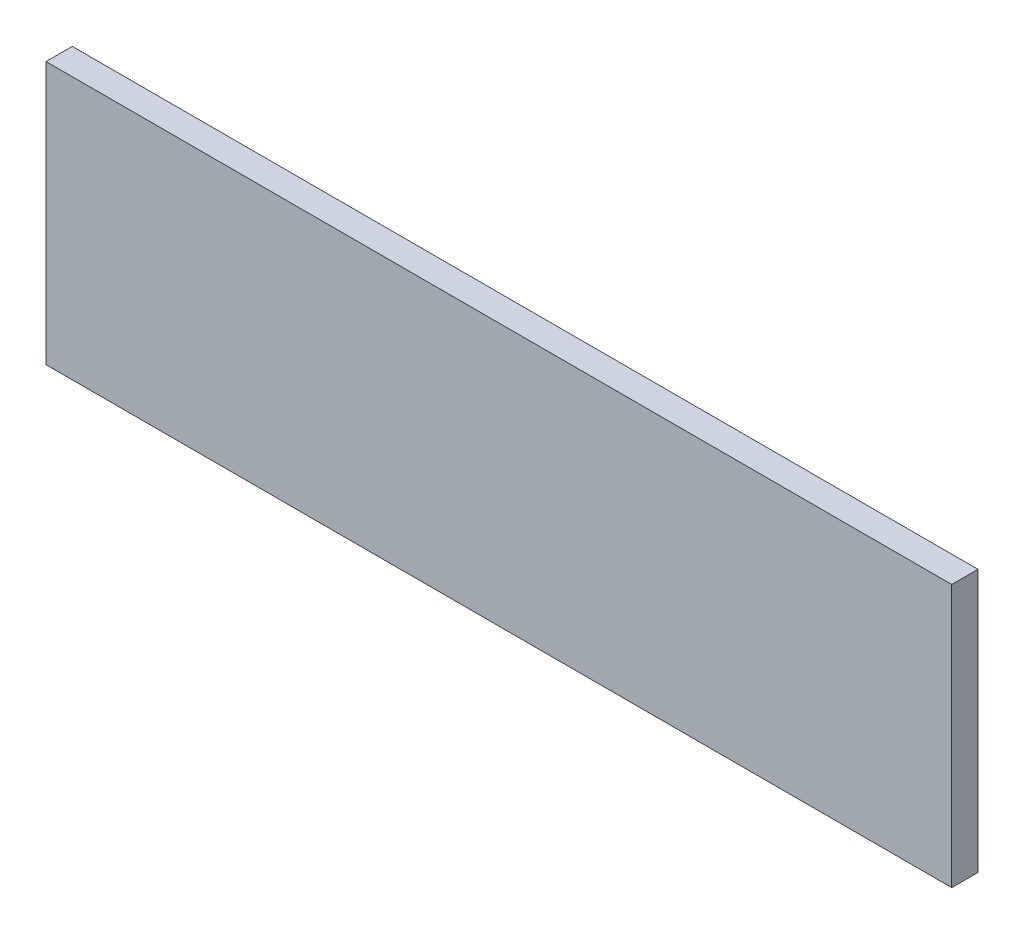
ISO-10303-21;
HEADER;
FILE_DESCRIPTION(('STEP AP214'),'2;1');
FILE_NAME('part.step','',(''),(''),'','','');
FILE_SCHEMA(('AUTOMOTIVE_DESIGN { 1 0 10303 214 1 1 1 1 }'));
ENDSEC;
DATA;
#1=APPLICATION_CONTEXT('core data for automotive mechanical design processes');
#2=APPLICATION_PROTOCOL_DEFINITION('international standard','automotive_design',2000,#1);
#3=PRODUCT_CONTEXT('',#1,'mechanical');
#4=PRODUCT('Part','Part','',(#3));
#5=PRODUCT_RELATED_PRODUCT_CATEGORY('part','',(#4));
#6=PRODUCT_DEFINITION_FORMATION('','',#4);
#7=PRODUCT_DEFINITION_CONTEXT('part definition',#1,'design');
#8=PRODUCT_DEFINITION('design','',#6,#7);
#9=PRODUCT_DEFINITION_SHAPE('','',#8);
#10=(LENGTH_UNIT() NAMED_UNIT(*) SI_UNIT(.MILLI.,.METRE.));
#11=(NAMED_UNIT(*) PLANE_ANGLE_UNIT() SI_UNIT($,.RADIAN.));
#12=(NAMED_UNIT(*) SI_UNIT($,.STERADIAN.) SOLID_ANGLE_UNIT());
#13=UNCERTAINTY_MEASURE_WITH_UNIT(LENGTH_MEASURE(1.E-05),#10,'distance_accuracy_value','');
#14=(GEOMETRIC_REPRESENTATION_CONTEXT(3) GLOBAL_UNCERTAINTY_ASSIGNED_CONTEXT((#13)) GLOBAL_UNIT_ASSIGNED_CONTEXT((#10,
#11,#12)) REPRESENTATION_CONTEXT('',''));
#15=CARTESIAN_POINT('',(0.,0.,0.));
#16=DIRECTION('',(0.,0.,1.));
#17=DIRECTION('',(1.,0.,0.));
#18=AXIS2_PLACEMENT_3D('',#15,#16,#17);
#19=CARTESIAN_POINT('',(2.96,-0.51,0.));
#20=DIRECTION('',(0.,0.,-1.));
#21=DIRECTION('',(-1.,0.,0.));
#22=AXIS2_PLACEMENT_3D('',#19,#20,#21);
#23=PLANE('',#22);
#24=DIRECTION('',(0.,-1.,0.));
#25=VECTOR('',#24,1.);
#26=CARTESIAN_POINT('',(-0.5,0.,0.));
#27=LINE('',#26,#25);
#28=CARTESIAN_POINT('',(-0.5,0.5,0.));
#29=VERTEX_POINT('',#28);
#30=CARTESIAN_POINT('',(-0.5,-0.5,0.));
#31=VERTEX_POINT('',#30);
#32=EDGE_CURVE('E68',#29,#31,#27,.T.);
#33=ORIENTED_EDGE('',*,*,#32,.F.);
#34=DIRECTION('',(-1.,0.,0.));
#35=VECTOR('',#34,1.);
#36=CARTESIAN_POINT('',(1.225,0.5,0.));
#37=LINE('',#36,#35);
#38=CARTESIAN_POINT('',(2.95,0.5,0.));
#39=VERTEX_POINT('',#38);
#40=EDGE_CURVE('E55',#39,#29,#37,.T.);
#41=ORIENTED_EDGE('',*,*,#40,.F.);
#42=DIRECTION('',(0.,1.,0.));
#43=VECTOR('',#42,1.);
#44=CARTESIAN_POINT('',(2.95,0.,0.));
#45=LINE('',#44,#43);
#46=CARTESIAN_POINT('',(2.95,-0.5,0.));
#47=VERTEX_POINT('',#46);
#48=EDGE_CURVE('E20',#47,#39,#45,.T.);
#49=ORIENTED_EDGE('',*,*,#48,.F.);
#50=DIRECTION('',(1.,0.,0.));
#51=VECTOR('',#50,1.);
#52=CARTESIAN_POINT('',(1.225,-0.5,0.));
#53=LINE('',#52,#51);
#54=EDGE_CURVE('E80',#31,#47,#53,.T.);
#55=ORIENTED_EDGE('',*,*,#54,.F.);
#56=EDGE_LOOP('',(#33,#41,#49,#55));
#57=FACE_BOUND('',#56,.T.);
#58=ADVANCED_FACE('F16',(#57),#23,.T.);
#59=CARTESIAN_POINT('',(2.95,-0.51,0.11));
#60=DIRECTION('',(1.,0.,0.));
#61=DIRECTION('',(0.,0.,-1.));
#62=AXIS2_PLACEMENT_3D('',#59,#60,#61);
#63=PLANE('',#62);
#64=DIRECTION('',(0.,0.,-1.));
#65=VECTOR('',#64,1.);
#66=CARTESIAN_POINT('',(2.95,0.5,0.05));
#67=LINE('',#66,#65);
#68=CARTESIAN_POINT('',(2.95,0.5,0.1));
#69=VERTEX_POINT('',#68);
#70=EDGE_CURVE('E61',#69,#39,#67,.T.);
#71=ORIENTED_EDGE('',*,*,#70,.F.);
#72=DIRECTION('',(0.,1.,0.));
#73=VECTOR('',#72,1.);
#74=CARTESIAN_POINT('',(2.95,0.,0.1));
#75=LINE('',#74,#73);
#76=CARTESIAN_POINT('',(2.95,-0.5,0.1));
#77=VERTEX_POINT('',#76);
#78=EDGE_CURVE('E83',#77,#69,#75,.T.);
#79=ORIENTED_EDGE('',*,*,#78,.F.);
#80=DIRECTION('',(0.,0.,1.));
#81=VECTOR('',#80,1.);
#82=CARTESIAN_POINT('',(2.95,-0.5,0.05));
#83=LINE('',#82,#81);
#84=EDGE_CURVE('E64',#47,#77,#83,.T.);
#85=ORIENTED_EDGE('',*,*,#84,.F.);
#86=ORIENTED_EDGE('',*,*,#48,.T.);
#87=EDGE_LOOP('',(#71,#79,#85,#86));
#88=FACE_BOUND('',#87,.T.);
#89=ADVANCED_FACE('F60',(#88),#63,.T.);
#90=CARTESIAN_POINT('',(-0.51,0.5,-0.01));
#91=DIRECTION('',(0.,1.,0.));
#92=DIRECTION('',(0.,0.,1.));
#93=AXIS2_PLACEMENT_3D('',#90,#91,#92);
#94=PLANE('',#93);
#95=DIRECTION('',(0.,0.,-1.));
#96=VECTOR('',#95,1.);
#97=CARTESIAN_POINT('',(-0.5,0.5,0.05));
#98=LINE('',#97,#96);
#99=CARTESIAN_POINT('',(-0.5,0.5,0.1));
#100=VERTEX_POINT('',#99);
#101=EDGE_CURVE('E70',#100,#29,#98,.T.);
#102=ORIENTED_EDGE('',*,*,#101,.F.);
#103=DIRECTION('',(-1.,0.,0.));
#104=VECTOR('',#103,1.);
#105=CARTESIAN_POINT('',(1.225,0.5,0.1));
#106=LINE('',#105,#104);
#107=EDGE_CURVE('E74',#69,#100,#106,.T.);
#108=ORIENTED_EDGE('',*,*,#107,.F.);
#109=ORIENTED_EDGE('',*,*,#70,.T.);
#110=ORIENTED_EDGE('',*,*,#40,.T.);
#111=EDGE_LOOP('',(#102,#108,#109,#110));
#112=FACE_BOUND('',#111,.T.);
#113=ADVANCED_FACE('F72',(#112),#94,.T.);
#114=CARTESIAN_POINT('',(-0.5,-0.51,-0.01));
#115=DIRECTION('',(-1.,0.,0.));
#116=DIRECTION('',(0.,0.,1.));
#117=AXIS2_PLACEMENT_3D('',#114,#115,#116);
#118=PLANE('',#117);
#119=DIRECTION('',(0.,0.,-1.));
#120=VECTOR('',#119,1.);
#121=CARTESIAN_POINT('',(-0.5,-0.5,0.05));
#122=LINE('',#121,#120);
#123=CARTESIAN_POINT('',(-0.5,-0.5,0.1));
#124=VERTEX_POINT('',#123);
#125=EDGE_CURVE('E35',#124,#31,#122,.T.);
#126=ORIENTED_EDGE('',*,*,#125,.F.);
#127=DIRECTION('',(0.,-1.,0.));
#128=VECTOR('',#127,1.);
#129=CARTESIAN_POINT('',(-0.5,0.,0.1));
#130=LINE('',#129,#128);
#131=EDGE_CURVE('E26',#100,#124,#130,.T.);
#132=ORIENTED_EDGE('',*,*,#131,.F.);
#133=ORIENTED_EDGE('',*,*,#101,.T.);
#134=ORIENTED_EDGE('',*,*,#32,.T.);
#135=EDGE_LOOP('',(#126,#132,#133,#134));
#136=FACE_BOUND('',#135,.T.);
#137=ADVANCED_FACE('F88',(#136),#118,.T.);
#138=CARTESIAN_POINT('',(-0.51,-0.5,0.11));
#139=DIRECTION('',(0.,-1.,0.));
#140=DIRECTION('',(0.,0.,-1.));
#141=AXIS2_PLACEMENT_3D('',#138,#139,#140);
#142=PLANE('',#141);
#143=ORIENTED_EDGE('',*,*,#84,.T.);
#144=DIRECTION('',(1.,0.,0.));
#145=VECTOR('',#144,1.);
#146=CARTESIAN_POINT('',(1.225,-0.5,0.1));
#147=LINE('',#146,#145);
#148=EDGE_CURVE('E11',#124,#77,#147,.T.);
#149=ORIENTED_EDGE('',*,*,#148,.F.);
#150=ORIENTED_EDGE('',*,*,#125,.T.);
#151=ORIENTED_EDGE('',*,*,#54,.T.);
#152=EDGE_LOOP('',(#143,#149,#150,#151));
#153=FACE_BOUND('',#152,.T.);
#154=ADVANCED_FACE('F90',(#153),#142,.T.);
#155=CARTESIAN_POINT('',(-0.51,-0.51,0.1));
#156=DIRECTION('',(0.,0.,1.));
#157=DIRECTION('',(1.,0.,0.));
#158=AXIS2_PLACEMENT_3D('',#155,#156,#157);
#159=PLANE('',#158);
#160=ORIENTED_EDGE('',*,*,#131,.T.);
#161=ORIENTED_EDGE('',*,*,#148,.T.);
#162=ORIENTED_EDGE('',*,*,#78,.T.);
#163=ORIENTED_EDGE('',*,*,#107,.T.);
#164=EDGE_LOOP('',(#160,#161,#162,#163));
#165=FACE_BOUND('',#164,.T.);
#166=ADVANCED_FACE('F18',(#165),#159,.T.);
#167=CLOSED_SHELL('',(#58,#89,#113,#137,#154,#166));
#168=MANIFOLD_SOLID_BREP('B1',#167);
#169=ADVANCED_BREP_SHAPE_REPRESENTATION('',(#18,#168),#14);
#170=SHAPE_DEFINITION_REPRESENTATION(#9,#169);
ENDSEC;
END-ISO-10303-21;
